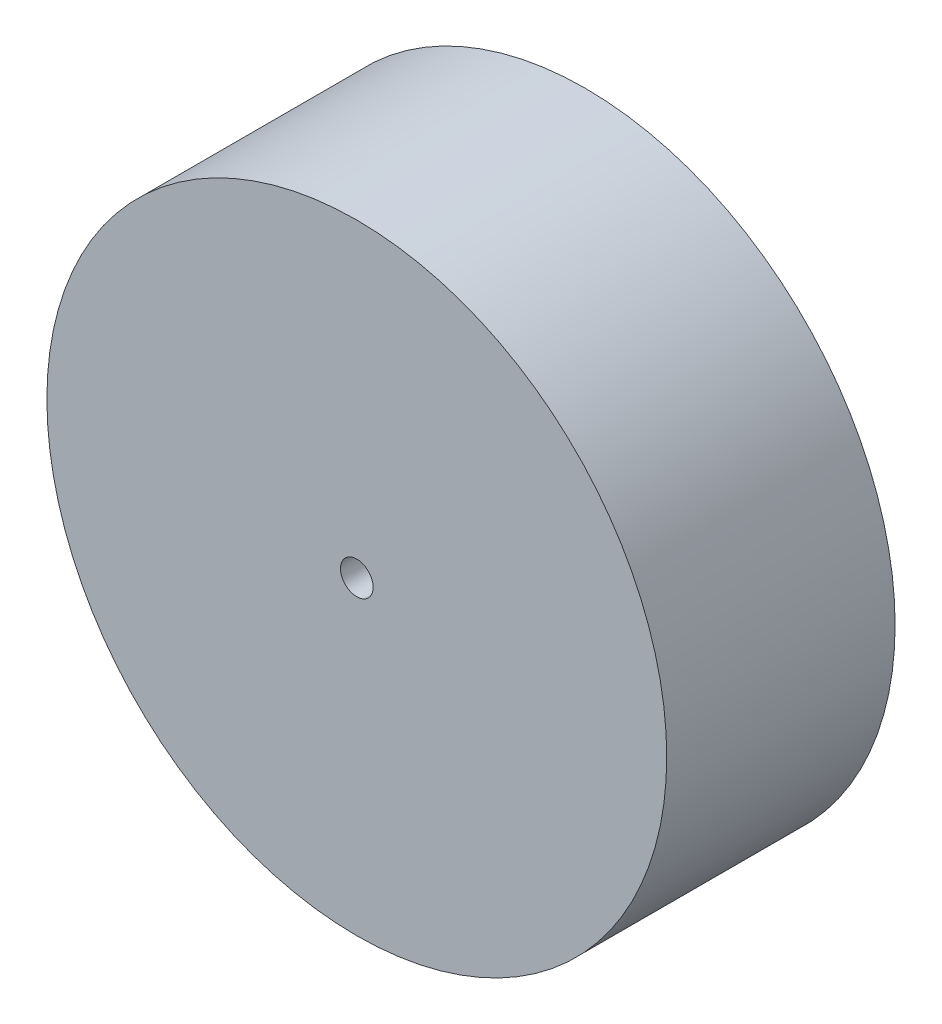
ISO-10303-21;
HEADER;
FILE_DESCRIPTION(('STEP AP214'),'2;1');
FILE_NAME('part.step','',(''),(''),'','','');
FILE_SCHEMA(('AUTOMOTIVE_DESIGN { 1 0 10303 214 1 1 1 1 }'));
ENDSEC;
DATA;
#1=APPLICATION_CONTEXT('core data for automotive mechanical design processes');
#2=APPLICATION_PROTOCOL_DEFINITION('international standard','automotive_design',2000,#1);
#3=PRODUCT_CONTEXT('',#1,'mechanical');
#4=PRODUCT('Part','Part','',(#3));
#5=PRODUCT_RELATED_PRODUCT_CATEGORY('part','',(#4));
#6=PRODUCT_DEFINITION_FORMATION('','',#4);
#7=PRODUCT_DEFINITION_CONTEXT('part definition',#1,'design');
#8=PRODUCT_DEFINITION('design','',#6,#7);
#9=PRODUCT_DEFINITION_SHAPE('','',#8);
#10=(LENGTH_UNIT() NAMED_UNIT(*) SI_UNIT(.MILLI.,.METRE.));
#11=(NAMED_UNIT(*) PLANE_ANGLE_UNIT() SI_UNIT($,.RADIAN.));
#12=(NAMED_UNIT(*) SI_UNIT($,.STERADIAN.) SOLID_ANGLE_UNIT());
#13=UNCERTAINTY_MEASURE_WITH_UNIT(LENGTH_MEASURE(1.E-05),#10,'distance_accuracy_value','');
#14=(GEOMETRIC_REPRESENTATION_CONTEXT(3) GLOBAL_UNCERTAINTY_ASSIGNED_CONTEXT((#13)) GLOBAL_UNIT_ASSIGNED_CONTEXT((#10,
#11,#12)) REPRESENTATION_CONTEXT('',''));
#15=CARTESIAN_POINT('',(0.,0.,0.));
#16=DIRECTION('',(0.,0.,1.));
#17=DIRECTION('',(1.,0.,0.));
#18=AXIS2_PLACEMENT_3D('',#15,#16,#17);
#19=CARTESIAN_POINT('',(0.,0.,14.));
#20=DIRECTION('',(0.,0.,-1.));
#21=DIRECTION('',(-1.,0.,0.));
#22=AXIS2_PLACEMENT_3D('',#19,#20,#21);
#23=CYLINDRICAL_SURFACE('',#22,19.);
#24=CARTESIAN_POINT('',(0.,0.,14.));
#25=DIRECTION('',(0.,0.,1.));
#26=DIRECTION('',(1.,0.,0.));
#27=AXIS2_PLACEMENT_3D('',#24,#25,#26);
#28=CIRCLE('',#27,19.);
#29=CARTESIAN_POINT('',(19.,0.,14.));
#30=VERTEX_POINT('',#29);
#31=EDGE_CURVE('E10',#30,#30,#28,.T.);
#32=ORIENTED_EDGE('',*,*,#31,.F.);
#33=EDGE_LOOP('',(#32));
#34=FACE_BOUND('',#33,.T.);
#35=CARTESIAN_POINT('',(0.,0.,0.));
#36=DIRECTION('',(0.,0.,1.));
#37=DIRECTION('',(1.,0.,0.));
#38=AXIS2_PLACEMENT_3D('',#35,#36,#37);
#39=CIRCLE('',#38,19.);
#40=CARTESIAN_POINT('',(19.,0.,0.));
#41=VERTEX_POINT('',#40);
#42=EDGE_CURVE('E42',#41,#41,#39,.T.);
#43=ORIENTED_EDGE('',*,*,#42,.T.);
#44=EDGE_LOOP('',(#43));
#45=FACE_BOUND('',#44,.T.);
#46=ADVANCED_FACE('F35',(#34,#45),#23,.T.);
#47=CARTESIAN_POINT('',(0.,0.,14.));
#48=DIRECTION('',(0.,0.,1.));
#49=DIRECTION('',(1.,0.,0.));
#50=AXIS2_PLACEMENT_3D('',#47,#48,#49);
#51=PLANE('',#50);
#52=CARTESIAN_POINT('',(0.,0.,14.));
#53=DIRECTION('',(0.,0.,1.));
#54=DIRECTION('',(1.,0.,0.));
#55=AXIS2_PLACEMENT_3D('',#52,#53,#54);
#56=CIRCLE('',#55,1.);
#57=CARTESIAN_POINT('',(1.,0.,14.));
#58=VERTEX_POINT('',#57);
#59=EDGE_CURVE('E48',#58,#58,#56,.T.);
#60=ORIENTED_EDGE('',*,*,#59,.F.);
#61=EDGE_LOOP('',(#60));
#62=FACE_BOUND('',#61,.T.);
#63=ORIENTED_EDGE('',*,*,#31,.T.);
#64=EDGE_LOOP('',(#63));
#65=FACE_BOUND('',#64,.T.);
#66=ADVANCED_FACE('F60',(#62,#65),#51,.T.);
#67=CARTESIAN_POINT('',(0.,0.,0.));
#68=DIRECTION('',(0.,0.,1.));
#69=DIRECTION('',(1.,0.,0.));
#70=AXIS2_PLACEMENT_3D('',#67,#68,#69);
#71=PLANE('',#70);
#72=CARTESIAN_POINT('',(0.,0.,0.));
#73=DIRECTION('',(0.,0.,1.));
#74=DIRECTION('',(1.,0.,0.));
#75=AXIS2_PLACEMENT_3D('',#72,#73,#74);
#76=CIRCLE('',#75,1.);
#77=CARTESIAN_POINT('',(1.,0.,0.));
#78=VERTEX_POINT('',#77);
#79=EDGE_CURVE('E38',#78,#78,#76,.F.);
#80=ORIENTED_EDGE('',*,*,#79,.F.);
#81=EDGE_LOOP('',(#80));
#82=FACE_BOUND('',#81,.T.);
#83=ORIENTED_EDGE('',*,*,#42,.F.);
#84=EDGE_LOOP('',(#83));
#85=FACE_BOUND('',#84,.T.);
#86=ADVANCED_FACE('F57',(#82,#85),#71,.F.);
#87=CARTESIAN_POINT('',(0.,0.,14.));
#88=DIRECTION('',(0.,0.,-1.));
#89=DIRECTION('',(-1.,0.,0.));
#90=AXIS2_PLACEMENT_3D('',#87,#88,#89);
#91=CYLINDRICAL_SURFACE('',#90,1.);
#92=ORIENTED_EDGE('',*,*,#59,.T.);
#93=EDGE_LOOP('',(#92));
#94=FACE_BOUND('',#93,.T.);
#95=ORIENTED_EDGE('',*,*,#79,.T.);
#96=EDGE_LOOP('',(#95));
#97=FACE_BOUND('',#96,.T.);
#98=ADVANCED_FACE('F55',(#94,#97),#91,.F.);
#99=CLOSED_SHELL('',(#46,#66,#86,#98));
#100=MANIFOLD_SOLID_BREP('B2',#99);
#101=ADVANCED_BREP_SHAPE_REPRESENTATION('',(#18,#100),#14);
#102=SHAPE_DEFINITION_REPRESENTATION(#9,#101);
ENDSEC;
END-ISO-10303-21;
